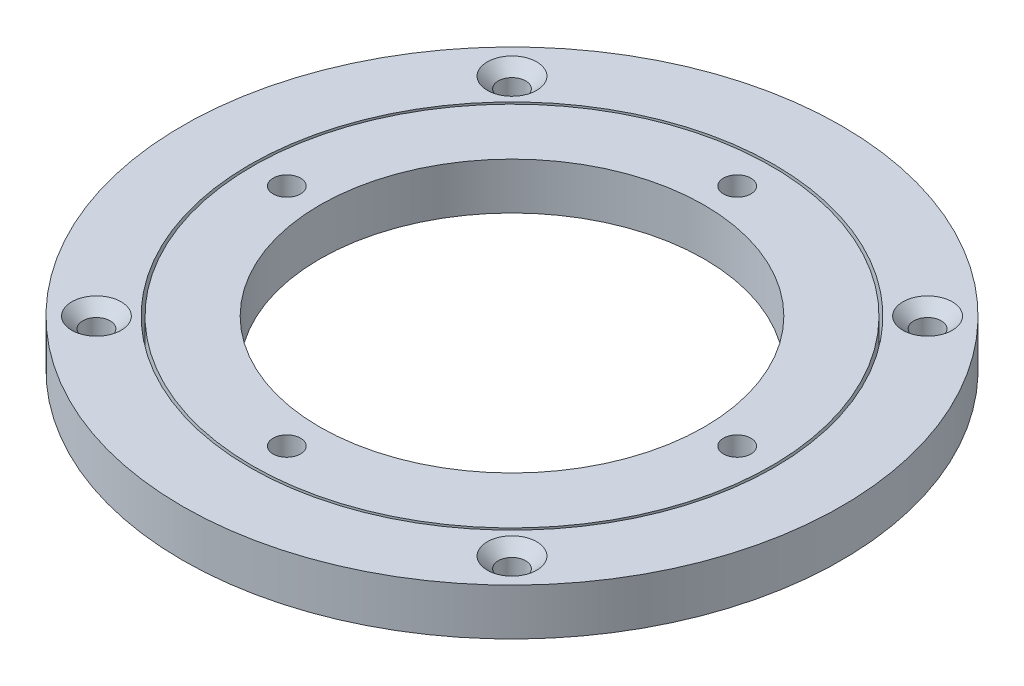
ISO-10303-21;
HEADER;
FILE_DESCRIPTION(('STEP AP214'),'2;1');
FILE_NAME('part.step','',(''),(''),'','','');
FILE_SCHEMA(('AUTOMOTIVE_DESIGN { 1 0 10303 214 1 1 1 1 }'));
ENDSEC;
DATA;
#1=APPLICATION_CONTEXT('core data for automotive mechanical design processes');
#2=APPLICATION_PROTOCOL_DEFINITION('international standard','automotive_design',2000,#1);
#3=PRODUCT_CONTEXT('',#1,'mechanical');
#4=PRODUCT('Part','Part','',(#3));
#5=PRODUCT_RELATED_PRODUCT_CATEGORY('part','',(#4));
#6=PRODUCT_DEFINITION_FORMATION('','',#4);
#7=PRODUCT_DEFINITION_CONTEXT('part definition',#1,'design');
#8=PRODUCT_DEFINITION('design','',#6,#7);
#9=PRODUCT_DEFINITION_SHAPE('','',#8);
#10=(LENGTH_UNIT() NAMED_UNIT(*) SI_UNIT(.MILLI.,.METRE.));
#11=(NAMED_UNIT(*) PLANE_ANGLE_UNIT() SI_UNIT($,.RADIAN.));
#12=(NAMED_UNIT(*) SI_UNIT($,.STERADIAN.) SOLID_ANGLE_UNIT());
#13=UNCERTAINTY_MEASURE_WITH_UNIT(LENGTH_MEASURE(1.E-05),#10,'distance_accuracy_value','');
#14=(GEOMETRIC_REPRESENTATION_CONTEXT(3) GLOBAL_UNCERTAINTY_ASSIGNED_CONTEXT((#13)) GLOBAL_UNIT_ASSIGNED_CONTEXT((#10,
#11,#12)) REPRESENTATION_CONTEXT('',''));
#15=CARTESIAN_POINT('',(0.,0.,0.));
#16=DIRECTION('',(0.,0.,1.));
#17=DIRECTION('',(1.,0.,0.));
#18=AXIS2_PLACEMENT_3D('',#15,#16,#17);
#19=CARTESIAN_POINT('',(0.,8.5,41.));
#20=DIRECTION('',(0.,-1.,0.));
#21=DIRECTION('',(0.,0.,-1.));
#22=AXIS2_PLACEMENT_3D('',#19,#20,#21);
#23=CYLINDRICAL_SURFACE('',#22,2.5);
#24=CARTESIAN_POINT('',(0.,8.5,41.));
#25=DIRECTION('',(0.,1.,0.));
#26=DIRECTION('',(0.,0.,1.));
#27=AXIS2_PLACEMENT_3D('',#24,#25,#26);
#28=CIRCLE('',#27,2.5);
#29=CARTESIAN_POINT('',(0.,8.5,43.5));
#30=VERTEX_POINT('',#29);
#31=EDGE_CURVE('E69',#30,#30,#28,.T.);
#32=ORIENTED_EDGE('',*,*,#31,.T.);
#33=EDGE_LOOP('',(#32));
#34=FACE_BOUND('',#33,.T.);
#35=CARTESIAN_POINT('',(0.,2.,41.));
#36=DIRECTION('',(0.,-1.,0.));
#37=DIRECTION('',(0.,0.,-1.));
#38=AXIS2_PLACEMENT_3D('',#35,#36,#37);
#39=CIRCLE('',#38,2.5);
#40=CARTESIAN_POINT('',(0.,2.,38.5));
#41=VERTEX_POINT('',#40);
#42=EDGE_CURVE('E126',#41,#41,#39,.T.);
#43=ORIENTED_EDGE('',*,*,#42,.T.);
#44=EDGE_LOOP('',(#43));
#45=FACE_BOUND('',#44,.T.);
#46=ADVANCED_FACE('F48',(#34,#45),#23,.F.);
#47=CARTESIAN_POINT('',(41.,8.5,0.));
#48=DIRECTION('',(0.,-1.,0.));
#49=DIRECTION('',(0.,0.,-1.));
#50=AXIS2_PLACEMENT_3D('',#47,#48,#49);
#51=CYLINDRICAL_SURFACE('',#50,2.49999999999999);
#52=CARTESIAN_POINT('',(41.,8.5,0.));
#53=DIRECTION('',(0.,1.,0.));
#54=DIRECTION('',(0.,0.,1.));
#55=AXIS2_PLACEMENT_3D('',#52,#53,#54);
#56=CIRCLE('',#55,2.49999999999999);
#57=CARTESIAN_POINT('',(41.,8.5,2.49999999999999));
#58=VERTEX_POINT('',#57);
#59=EDGE_CURVE('E60',#58,#58,#56,.T.);
#60=ORIENTED_EDGE('',*,*,#59,.T.);
#61=EDGE_LOOP('',(#60));
#62=FACE_BOUND('',#61,.T.);
#63=CARTESIAN_POINT('',(41.,2.,0.));
#64=DIRECTION('',(0.,-1.,0.));
#65=DIRECTION('',(0.,0.,-1.));
#66=AXIS2_PLACEMENT_3D('',#63,#64,#65);
#67=CIRCLE('',#66,2.5);
#68=CARTESIAN_POINT('',(41.,2.,-2.5));
#69=VERTEX_POINT('',#68);
#70=EDGE_CURVE('E76',#69,#69,#67,.T.);
#71=ORIENTED_EDGE('',*,*,#70,.T.);
#72=EDGE_LOOP('',(#71));
#73=FACE_BOUND('',#72,.T.);
#74=ADVANCED_FACE('F90',(#62,#73),#51,.F.);
#75=CARTESIAN_POINT('',(0.,8.5,-41.));
#76=DIRECTION('',(0.,-1.,0.));
#77=DIRECTION('',(0.,0.,-1.));
#78=AXIS2_PLACEMENT_3D('',#75,#76,#77);
#79=CYLINDRICAL_SURFACE('',#78,2.5);
#80=CARTESIAN_POINT('',(0.,8.5,-41.));
#81=DIRECTION('',(0.,1.,0.));
#82=DIRECTION('',(0.,0.,1.));
#83=AXIS2_PLACEMENT_3D('',#80,#81,#82);
#84=CIRCLE('',#83,2.5);
#85=CARTESIAN_POINT('',(0.,8.5,-38.5));
#86=VERTEX_POINT('',#85);
#87=EDGE_CURVE('E85',#86,#86,#84,.T.);
#88=ORIENTED_EDGE('',*,*,#87,.T.);
#89=EDGE_LOOP('',(#88));
#90=FACE_BOUND('',#89,.T.);
#91=CARTESIAN_POINT('',(0.,2.,-41.));
#92=DIRECTION('',(0.,-1.,0.));
#93=DIRECTION('',(0.,0.,-1.));
#94=AXIS2_PLACEMENT_3D('',#91,#92,#93);
#95=CIRCLE('',#94,2.5);
#96=CARTESIAN_POINT('',(0.,2.,-43.5));
#97=VERTEX_POINT('',#96);
#98=EDGE_CURVE('E65',#97,#97,#95,.T.);
#99=ORIENTED_EDGE('',*,*,#98,.T.);
#100=EDGE_LOOP('',(#99));
#101=FACE_BOUND('',#100,.T.);
#102=ADVANCED_FACE('F106',(#90,#101),#79,.F.);
#103=CARTESIAN_POINT('',(0.,8.5,0.));
#104=DIRECTION('',(0.,-1.,0.));
#105=DIRECTION('',(0.,0.,-1.));
#106=AXIS2_PLACEMENT_3D('',#103,#104,#105);
#107=CYLINDRICAL_SURFACE('',#106,35.);
#108=CARTESIAN_POINT('',(0.,8.5,0.));
#109=DIRECTION('',(0.,1.,0.));
#110=DIRECTION('',(0.,0.,1.));
#111=AXIS2_PLACEMENT_3D('',#108,#109,#110);
#112=CIRCLE('',#111,35.);
#113=CARTESIAN_POINT('',(0.,8.5,35.));
#114=VERTEX_POINT('',#113);
#115=EDGE_CURVE('E55',#114,#114,#112,.T.);
#116=ORIENTED_EDGE('',*,*,#115,.T.);
#117=EDGE_LOOP('',(#116));
#118=FACE_BOUND('',#117,.T.);
#119=CARTESIAN_POINT('',(0.,0.,0.));
#120=DIRECTION('',(0.,1.,0.));
#121=DIRECTION('',(0.,0.,1.));
#122=AXIS2_PLACEMENT_3D('',#119,#120,#121);
#123=CIRCLE('',#122,35.);
#124=CARTESIAN_POINT('',(0.,0.,35.));
#125=VERTEX_POINT('',#124);
#126=EDGE_CURVE('E63',#125,#125,#123,.T.);
#127=ORIENTED_EDGE('',*,*,#126,.F.);
#128=EDGE_LOOP('',(#127));
#129=FACE_BOUND('',#128,.T.);
#130=ADVANCED_FACE('F102',(#118,#129),#107,.F.);
#131=CARTESIAN_POINT('',(-41.,8.5,0.));
#132=DIRECTION('',(0.,-1.,0.));
#133=DIRECTION('',(0.,0.,-1.));
#134=AXIS2_PLACEMENT_3D('',#131,#132,#133);
#135=CYLINDRICAL_SURFACE('',#134,2.49999999999999);
#136=CARTESIAN_POINT('',(-41.,2.,0.));
#137=DIRECTION('',(0.,-1.,0.));
#138=DIRECTION('',(0.,0.,-1.));
#139=AXIS2_PLACEMENT_3D('',#136,#137,#138);
#140=CIRCLE('',#139,2.5);
#141=CARTESIAN_POINT('',(-41.,2.,-2.5));
#142=VERTEX_POINT('',#141);
#143=EDGE_CURVE('E134',#142,#142,#140,.T.);
#144=ORIENTED_EDGE('',*,*,#143,.T.);
#145=EDGE_LOOP('',(#144));
#146=FACE_BOUND('',#145,.T.);
#147=CARTESIAN_POINT('',(-41.,8.5,0.));
#148=DIRECTION('',(0.,1.,0.));
#149=DIRECTION('',(0.,0.,1.));
#150=AXIS2_PLACEMENT_3D('',#147,#148,#149);
#151=CIRCLE('',#150,2.49999999999999);
#152=CARTESIAN_POINT('',(-41.,8.5,2.49999999999999));
#153=VERTEX_POINT('',#152);
#154=EDGE_CURVE('E82',#153,#153,#151,.T.);
#155=ORIENTED_EDGE('',*,*,#154,.T.);
#156=EDGE_LOOP('',(#155));
#157=FACE_BOUND('',#156,.T.);
#158=ADVANCED_FACE('F105',(#146,#157),#135,.F.);
#159=CARTESIAN_POINT('',(0.,8.5,0.));
#160=DIRECTION('',(0.,-1.,0.));
#161=DIRECTION('',(0.,0.,-1.));
#162=AXIS2_PLACEMENT_3D('',#159,#160,#161);
#163=CYLINDRICAL_SURFACE('',#162,47.25);
#164=CARTESIAN_POINT('',(0.,8.5,0.));
#165=DIRECTION('',(0.,1.,0.));
#166=DIRECTION('',(0.,0.,1.));
#167=AXIS2_PLACEMENT_3D('',#164,#165,#166);
#168=CIRCLE('',#167,47.25);
#169=CARTESIAN_POINT('',(0.,8.5,47.25));
#170=VERTEX_POINT('',#169);
#171=EDGE_CURVE('E12',#170,#170,#168,.T.);
#172=ORIENTED_EDGE('',*,*,#171,.F.);
#173=EDGE_LOOP('',(#172));
#174=FACE_BOUND('',#173,.T.);
#175=CARTESIAN_POINT('',(0.,0.,0.));
#176=DIRECTION('',(0.,1.,0.));
#177=DIRECTION('',(0.,0.,1.));
#178=AXIS2_PLACEMENT_3D('',#175,#176,#177);
#179=CIRCLE('',#178,47.25);
#180=CARTESIAN_POINT('',(0.,0.,47.25));
#181=VERTEX_POINT('',#180);
#182=EDGE_CURVE('E51',#181,#181,#179,.T.);
#183=ORIENTED_EDGE('',*,*,#182,.T.);
#184=EDGE_LOOP('',(#183));
#185=FACE_BOUND('',#184,.T.);
#186=ADVANCED_FACE('F97',(#174,#185),#163,.T.);
#187=CARTESIAN_POINT('',(0.,8.5,0.));
#188=DIRECTION('',(0.,1.,0.));
#189=DIRECTION('',(0.,0.,1.));
#190=AXIS2_PLACEMENT_3D('',#187,#188,#189);
#191=PLANE('',#190);
#192=ORIENTED_EDGE('',*,*,#31,.F.);
#193=EDGE_LOOP('',(#192));
#194=FACE_BOUND('',#193,.T.);
#195=ORIENTED_EDGE('',*,*,#154,.F.);
#196=EDGE_LOOP('',(#195));
#197=FACE_BOUND('',#196,.T.);
#198=ORIENTED_EDGE('',*,*,#87,.F.);
#199=EDGE_LOOP('',(#198));
#200=FACE_BOUND('',#199,.T.);
#201=ORIENTED_EDGE('',*,*,#59,.F.);
#202=EDGE_LOOP('',(#201));
#203=FACE_BOUND('',#202,.T.);
#204=ORIENTED_EDGE('',*,*,#115,.F.);
#205=EDGE_LOOP('',(#204));
#206=FACE_BOUND('',#205,.T.);
#207=ORIENTED_EDGE('',*,*,#171,.T.);
#208=EDGE_LOOP('',(#207));
#209=FACE_BOUND('',#208,.T.);
#210=ADVANCED_FACE('F93',(#194,#197,#200,#203,#206,#209),#191,.T.);
#211=CARTESIAN_POINT('',(0.,0.,0.));
#212=DIRECTION('',(0.,1.,0.));
#213=DIRECTION('',(0.,0.,1.));
#214=AXIS2_PLACEMENT_3D('',#211,#212,#213);
#215=PLANE('',#214);
#216=CARTESIAN_POINT('',(-41.,0.,0.));
#217=DIRECTION('',(0.,-1.,0.));
#218=DIRECTION('',(0.,0.,-1.));
#219=AXIS2_PLACEMENT_3D('',#216,#217,#218);
#220=CIRCLE('',#219,4.5);
#221=CARTESIAN_POINT('',(-41.,0.,-4.5));
#222=VERTEX_POINT('',#221);
#223=EDGE_CURVE('E176',#222,#222,#220,.T.);
#224=ORIENTED_EDGE('',*,*,#223,.F.);
#225=EDGE_LOOP('',(#224));
#226=FACE_BOUND('',#225,.T.);
#227=CARTESIAN_POINT('',(0.,0.,41.));
#228=DIRECTION('',(0.,-1.,0.));
#229=DIRECTION('',(0.,0.,-1.));
#230=AXIS2_PLACEMENT_3D('',#227,#228,#229);
#231=CIRCLE('',#230,4.5);
#232=CARTESIAN_POINT('',(0.,0.,36.5));
#233=VERTEX_POINT('',#232);
#234=EDGE_CURVE('E129',#233,#233,#231,.T.);
#235=ORIENTED_EDGE('',*,*,#234,.F.);
#236=EDGE_LOOP('',(#235));
#237=FACE_BOUND('',#236,.T.);
#238=CARTESIAN_POINT('',(41.,0.,0.));
#239=DIRECTION('',(0.,-1.,0.));
#240=DIRECTION('',(0.,0.,-1.));
#241=AXIS2_PLACEMENT_3D('',#238,#239,#240);
#242=CIRCLE('',#241,4.5);
#243=CARTESIAN_POINT('',(41.,0.,-4.5));
#244=VERTEX_POINT('',#243);
#245=EDGE_CURVE('E128',#244,#244,#242,.T.);
#246=ORIENTED_EDGE('',*,*,#245,.F.);
#247=EDGE_LOOP('',(#246));
#248=FACE_BOUND('',#247,.T.);
#249=CARTESIAN_POINT('',(0.,0.,-41.));
#250=DIRECTION('',(0.,-1.,0.));
#251=DIRECTION('',(0.,0.,-1.));
#252=AXIS2_PLACEMENT_3D('',#249,#250,#251);
#253=CIRCLE('',#252,4.5);
#254=CARTESIAN_POINT('',(0.,0.,-45.5));
#255=VERTEX_POINT('',#254);
#256=EDGE_CURVE('E71',#255,#255,#253,.T.);
#257=ORIENTED_EDGE('',*,*,#256,.F.);
#258=EDGE_LOOP('',(#257));
#259=FACE_BOUND('',#258,.T.);
#260=ORIENTED_EDGE('',*,*,#126,.T.);
#261=EDGE_LOOP('',(#260));
#262=FACE_BOUND('',#261,.T.);
#263=ORIENTED_EDGE('',*,*,#182,.F.);
#264=EDGE_LOOP('',(#263));
#265=FACE_BOUND('',#264,.T.);
#266=ADVANCED_FACE('F96',(#226,#237,#248,#259,#262,#265),#215,.F.);
#267=CARTESIAN_POINT('',(0.,0.,-41.));
#268=DIRECTION('',(0.,-1.,0.));
#269=DIRECTION('',(0.,0.,-1.));
#270=AXIS2_PLACEMENT_3D('',#267,#268,#269);
#271=CONICAL_SURFACE('',#270,4.5,0.785398163397448);
#272=ORIENTED_EDGE('',*,*,#98,.F.);
#273=EDGE_LOOP('',(#272));
#274=FACE_BOUND('',#273,.T.);
#275=ORIENTED_EDGE('',*,*,#256,.T.);
#276=EDGE_LOOP('',(#275));
#277=FACE_BOUND('',#276,.T.);
#278=ADVANCED_FACE('F144',(#274,#277),#271,.F.);
#279=CARTESIAN_POINT('',(41.,0.,0.));
#280=DIRECTION('',(0.,-1.,0.));
#281=DIRECTION('',(0.,0.,-1.));
#282=AXIS2_PLACEMENT_3D('',#279,#280,#281);
#283=CONICAL_SURFACE('',#282,4.5,0.785398163397447);
#284=ORIENTED_EDGE('',*,*,#70,.F.);
#285=EDGE_LOOP('',(#284));
#286=FACE_BOUND('',#285,.T.);
#287=ORIENTED_EDGE('',*,*,#245,.T.);
#288=EDGE_LOOP('',(#287));
#289=FACE_BOUND('',#288,.T.);
#290=ADVANCED_FACE('F140',(#286,#289),#283,.F.);
#291=CARTESIAN_POINT('',(0.,0.,41.));
#292=DIRECTION('',(0.,-1.,0.));
#293=DIRECTION('',(0.,0.,-1.));
#294=AXIS2_PLACEMENT_3D('',#291,#292,#293);
#295=CONICAL_SURFACE('',#294,4.5,0.785398163397448);
#296=ORIENTED_EDGE('',*,*,#42,.F.);
#297=EDGE_LOOP('',(#296));
#298=FACE_BOUND('',#297,.T.);
#299=ORIENTED_EDGE('',*,*,#234,.T.);
#300=EDGE_LOOP('',(#299));
#301=FACE_BOUND('',#300,.T.);
#302=ADVANCED_FACE('F143',(#298,#301),#295,.F.);
#303=CARTESIAN_POINT('',(-41.,0.,0.));
#304=DIRECTION('',(0.,-1.,0.));
#305=DIRECTION('',(0.,0.,-1.));
#306=AXIS2_PLACEMENT_3D('',#303,#304,#305);
#307=CONICAL_SURFACE('',#306,4.5,0.785398163397447);
#308=ORIENTED_EDGE('',*,*,#143,.F.);
#309=EDGE_LOOP('',(#308));
#310=FACE_BOUND('',#309,.T.);
#311=ORIENTED_EDGE('',*,*,#223,.T.);
#312=EDGE_LOOP('',(#311));
#313=FACE_BOUND('',#312,.T.);
#314=ADVANCED_FACE('F166',(#310,#313),#307,.F.);
#315=CLOSED_SHELL('',(#46,#74,#102,#130,#158,#186,#210,#266,#278,#290,#302,#314));
#316=MANIFOLD_SOLID_BREP('B2',#315);
#317=CARTESIAN_POINT('',(-37.8302127934803,8.5,-37.8302127934803));
#318=DIRECTION('',(0.,-1.,0.));
#319=DIRECTION('',(0.,0.,-1.));
#320=AXIS2_PLACEMENT_3D('',#317,#318,#319);
#321=CYLINDRICAL_SURFACE('',#320,2.5);
#322=CARTESIAN_POINT('',(-37.8302127934803,0.,-37.8302127934803));
#323=DIRECTION('',(0.,1.,0.));
#324=DIRECTION('',(0.,0.,1.));
#325=AXIS2_PLACEMENT_3D('',#322,#323,#324);
#326=CIRCLE('',#325,2.5);
#327=CARTESIAN_POINT('',(-37.8302127934803,0.,-35.3302127934803));
#328=VERTEX_POINT('',#327);
#329=EDGE_CURVE('E279',#328,#328,#326,.T.);
#330=ORIENTED_EDGE('',*,*,#329,.F.);
#331=EDGE_LOOP('',(#330));
#332=FACE_BOUND('',#331,.T.);
#333=CARTESIAN_POINT('',(-37.8302127934803,6.5,-37.8302127934803));
#334=DIRECTION('',(0.,1.,0.));
#335=DIRECTION('',(0.,0.,1.));
#336=AXIS2_PLACEMENT_3D('',#333,#334,#335);
#337=CIRCLE('',#336,2.5);
#338=CARTESIAN_POINT('',(-37.8302127934803,6.5,-35.3302127934803));
#339=VERTEX_POINT('',#338);
#340=EDGE_CURVE('E410',#339,#339,#337,.T.);
#341=ORIENTED_EDGE('',*,*,#340,.T.);
#342=EDGE_LOOP('',(#341));
#343=FACE_BOUND('',#342,.T.);
#344=ADVANCED_FACE('F253',(#332,#343),#321,.F.);
#345=CARTESIAN_POINT('',(37.8302127934803,8.5,-37.8302127934803));
#346=DIRECTION('',(0.,-1.,0.));
#347=DIRECTION('',(0.,0.,-1.));
#348=AXIS2_PLACEMENT_3D('',#345,#346,#347);
#349=CYLINDRICAL_SURFACE('',#348,2.5);
#350=CARTESIAN_POINT('',(37.8302127934803,0.,-37.8302127934803));
#351=DIRECTION('',(0.,1.,0.));
#352=DIRECTION('',(0.,0.,1.));
#353=AXIS2_PLACEMENT_3D('',#350,#351,#352);
#354=CIRCLE('',#353,2.5);
#355=CARTESIAN_POINT('',(37.8302127934803,0.,-35.3302127934803));
#356=VERTEX_POINT('',#355);
#357=EDGE_CURVE('E281',#356,#356,#354,.T.);
#358=ORIENTED_EDGE('',*,*,#357,.F.);
#359=EDGE_LOOP('',(#358));
#360=FACE_BOUND('',#359,.T.);
#361=CARTESIAN_POINT('',(37.8302127934803,6.5,-37.8302127934803));
#362=DIRECTION('',(0.,1.,0.));
#363=DIRECTION('',(0.,0.,1.));
#364=AXIS2_PLACEMENT_3D('',#361,#362,#363);
#365=CIRCLE('',#364,2.5);
#366=CARTESIAN_POINT('',(37.8302127934803,6.5,-35.3302127934803));
#367=VERTEX_POINT('',#366);
#368=EDGE_CURVE('E339',#367,#367,#365,.T.);
#369=ORIENTED_EDGE('',*,*,#368,.T.);
#370=EDGE_LOOP('',(#369));
#371=FACE_BOUND('',#370,.T.);
#372=ADVANCED_FACE('F308',(#360,#371),#349,.F.);
#373=CARTESIAN_POINT('',(37.8302127934803,8.5,37.8302127934803));
#374=DIRECTION('',(0.,-1.,0.));
#375=DIRECTION('',(0.,0.,-1.));
#376=AXIS2_PLACEMENT_3D('',#373,#374,#375);
#377=CYLINDRICAL_SURFACE('',#376,2.5);
#378=CARTESIAN_POINT('',(37.8302127934803,0.,37.8302127934803));
#379=DIRECTION('',(0.,1.,0.));
#380=DIRECTION('',(0.,0.,1.));
#381=AXIS2_PLACEMENT_3D('',#378,#379,#380);
#382=CIRCLE('',#381,2.5);
#383=CARTESIAN_POINT('',(37.8302127934803,0.,40.3302127934803));
#384=VERTEX_POINT('',#383);
#385=EDGE_CURVE('E272',#384,#384,#382,.T.);
#386=ORIENTED_EDGE('',*,*,#385,.F.);
#387=EDGE_LOOP('',(#386));
#388=FACE_BOUND('',#387,.T.);
#389=CARTESIAN_POINT('',(37.8302127934803,6.5,37.8302127934803));
#390=DIRECTION('',(0.,1.,0.));
#391=DIRECTION('',(0.,0.,1.));
#392=AXIS2_PLACEMENT_3D('',#389,#390,#391);
#393=CIRCLE('',#392,2.5);
#394=CARTESIAN_POINT('',(37.8302127934803,6.5,40.3302127934803));
#395=VERTEX_POINT('',#394);
#396=EDGE_CURVE('E331',#395,#395,#393,.T.);
#397=ORIENTED_EDGE('',*,*,#396,.T.);
#398=EDGE_LOOP('',(#397));
#399=FACE_BOUND('',#398,.T.);
#400=ADVANCED_FACE('F314',(#388,#399),#377,.F.);
#401=CARTESIAN_POINT('',(-37.8302127934803,8.5,37.8302127934803));
#402=DIRECTION('',(0.,-1.,0.));
#403=DIRECTION('',(0.,0.,-1.));
#404=AXIS2_PLACEMENT_3D('',#401,#402,#403);
#405=CYLINDRICAL_SURFACE('',#404,2.5);
#406=CARTESIAN_POINT('',(-37.8302127934803,0.,37.8302127934803));
#407=DIRECTION('',(0.,1.,0.));
#408=DIRECTION('',(0.,0.,1.));
#409=AXIS2_PLACEMENT_3D('',#406,#407,#408);
#410=CIRCLE('',#409,2.5);
#411=CARTESIAN_POINT('',(-37.8302127934803,0.,40.3302127934803));
#412=VERTEX_POINT('',#411);
#413=EDGE_CURVE('E276',#412,#412,#410,.T.);
#414=ORIENTED_EDGE('',*,*,#413,.F.);
#415=EDGE_LOOP('',(#414));
#416=FACE_BOUND('',#415,.T.);
#417=CARTESIAN_POINT('',(-37.8302127934803,6.5,37.8302127934803));
#418=DIRECTION('',(0.,1.,0.));
#419=DIRECTION('',(0.,0.,1.));
#420=AXIS2_PLACEMENT_3D('',#417,#418,#419);
#421=CIRCLE('',#420,2.5);
#422=CARTESIAN_POINT('',(-37.8302127934803,6.5,40.3302127934803));
#423=VERTEX_POINT('',#422);
#424=EDGE_CURVE('E273',#423,#423,#421,.T.);
#425=ORIENTED_EDGE('',*,*,#424,.T.);
#426=EDGE_LOOP('',(#425));
#427=FACE_BOUND('',#426,.T.);
#428=ADVANCED_FACE('F320',(#416,#427),#405,.F.);
#429=CARTESIAN_POINT('',(0.,8.5,0.));
#430=DIRECTION('',(0.,-1.,0.));
#431=DIRECTION('',(0.,0.,-1.));
#432=AXIS2_PLACEMENT_3D('',#429,#430,#431);
#433=CYLINDRICAL_SURFACE('',#432,47.75);
#434=CARTESIAN_POINT('',(0.,8.5,0.));
#435=DIRECTION('',(0.,1.,0.));
#436=DIRECTION('',(0.,0.,1.));
#437=AXIS2_PLACEMENT_3D('',#434,#435,#436);
#438=CIRCLE('',#437,47.75);
#439=CARTESIAN_POINT('',(0.,8.5,47.75));
#440=VERTEX_POINT('',#439);
#441=EDGE_CURVE('E261',#440,#440,#438,.T.);
#442=ORIENTED_EDGE('',*,*,#441,.T.);
#443=EDGE_LOOP('',(#442));
#444=FACE_BOUND('',#443,.T.);
#445=CARTESIAN_POINT('',(0.,0.,0.));
#446=DIRECTION('',(0.,1.,0.));
#447=DIRECTION('',(0.,0.,1.));
#448=AXIS2_PLACEMENT_3D('',#445,#446,#447);
#449=CIRCLE('',#448,47.75);
#450=CARTESIAN_POINT('',(0.,0.,47.75));
#451=VERTEX_POINT('',#450);
#452=EDGE_CURVE('E269',#451,#451,#449,.T.);
#453=ORIENTED_EDGE('',*,*,#452,.F.);
#454=EDGE_LOOP('',(#453));
#455=FACE_BOUND('',#454,.T.);
#456=ADVANCED_FACE('F255',(#444,#455),#433,.F.);
#457=CARTESIAN_POINT('',(0.,8.5,0.));
#458=DIRECTION('',(0.,-1.,0.));
#459=DIRECTION('',(0.,0.,-1.));
#460=AXIS2_PLACEMENT_3D('',#457,#458,#459);
#461=CYLINDRICAL_SURFACE('',#460,60.);
#462=CARTESIAN_POINT('',(0.,8.5,0.));
#463=DIRECTION('',(0.,1.,0.));
#464=DIRECTION('',(0.,0.,1.));
#465=AXIS2_PLACEMENT_3D('',#462,#463,#464);
#466=CIRCLE('',#465,60.);
#467=CARTESIAN_POINT('',(0.,8.5,60.));
#468=VERTEX_POINT('',#467);
#469=EDGE_CURVE('E47',#468,#468,#466,.T.);
#470=ORIENTED_EDGE('',*,*,#469,.F.);
#471=EDGE_LOOP('',(#470));
#472=FACE_BOUND('',#471,.T.);
#473=CARTESIAN_POINT('',(0.,0.,0.));
#474=DIRECTION('',(0.,1.,0.));
#475=DIRECTION('',(0.,0.,1.));
#476=AXIS2_PLACEMENT_3D('',#473,#474,#475);
#477=CIRCLE('',#476,60.);
#478=CARTESIAN_POINT('',(0.,0.,60.));
#479=VERTEX_POINT('',#478);
#480=EDGE_CURVE('E257',#479,#479,#477,.T.);
#481=ORIENTED_EDGE('',*,*,#480,.T.);
#482=EDGE_LOOP('',(#481));
#483=FACE_BOUND('',#482,.T.);
#484=ADVANCED_FACE('F288',(#472,#483),#461,.T.);
#485=CARTESIAN_POINT('',(0.,8.5,0.));
#486=DIRECTION('',(0.,1.,0.));
#487=DIRECTION('',(0.,0.,1.));
#488=AXIS2_PLACEMENT_3D('',#485,#486,#487);
#489=PLANE('',#488);
#490=CARTESIAN_POINT('',(-37.8302127934803,8.5,-37.8302127934803));
#491=DIRECTION('',(0.,1.,0.));
#492=DIRECTION('',(0.,0.,1.));
#493=AXIS2_PLACEMENT_3D('',#490,#491,#492);
#494=CIRCLE('',#493,4.5);
#495=CARTESIAN_POINT('',(-37.8302127934803,8.5,-33.3302127934803));
#496=VERTEX_POINT('',#495);
#497=EDGE_CURVE('E413',#496,#496,#494,.T.);
#498=ORIENTED_EDGE('',*,*,#497,.F.);
#499=EDGE_LOOP('',(#498));
#500=FACE_BOUND('',#499,.T.);
#501=CARTESIAN_POINT('',(37.8302127934803,8.5,-37.8302127934803));
#502=DIRECTION('',(0.,1.,0.));
#503=DIRECTION('',(0.,0.,1.));
#504=AXIS2_PLACEMENT_3D('',#501,#502,#503);
#505=CIRCLE('',#504,4.5);
#506=CARTESIAN_POINT('',(37.8302127934803,8.5,-33.3302127934803));
#507=VERTEX_POINT('',#506);
#508=EDGE_CURVE('E415',#507,#507,#505,.T.);
#509=ORIENTED_EDGE('',*,*,#508,.F.);
#510=EDGE_LOOP('',(#509));
#511=FACE_BOUND('',#510,.T.);
#512=CARTESIAN_POINT('',(37.8302127934803,8.5,37.8302127934803));
#513=DIRECTION('',(0.,1.,0.));
#514=DIRECTION('',(0.,0.,1.));
#515=AXIS2_PLACEMENT_3D('',#512,#513,#514);
#516=CIRCLE('',#515,4.5);
#517=CARTESIAN_POINT('',(37.8302127934803,8.5,42.3302127934803));
#518=VERTEX_POINT('',#517);
#519=EDGE_CURVE('E334',#518,#518,#516,.T.);
#520=ORIENTED_EDGE('',*,*,#519,.F.);
#521=EDGE_LOOP('',(#520));
#522=FACE_BOUND('',#521,.T.);
#523=CARTESIAN_POINT('',(-37.8302127934803,8.5,37.8302127934803));
#524=DIRECTION('',(0.,1.,0.));
#525=DIRECTION('',(0.,0.,1.));
#526=AXIS2_PLACEMENT_3D('',#523,#524,#525);
#527=CIRCLE('',#526,4.5);
#528=CARTESIAN_POINT('',(-37.8302127934803,8.5,42.3302127934803));
#529=VERTEX_POINT('',#528);
#530=EDGE_CURVE('E333',#529,#529,#527,.T.);
#531=ORIENTED_EDGE('',*,*,#530,.F.);
#532=EDGE_LOOP('',(#531));
#533=FACE_BOUND('',#532,.T.);
#534=ORIENTED_EDGE('',*,*,#441,.F.);
#535=EDGE_LOOP('',(#534));
#536=FACE_BOUND('',#535,.T.);
#537=ORIENTED_EDGE('',*,*,#469,.T.);
#538=EDGE_LOOP('',(#537));
#539=FACE_BOUND('',#538,.T.);
#540=ADVANCED_FACE('F293',(#500,#511,#522,#533,#536,#539),#489,.T.);
#541=CARTESIAN_POINT('',(0.,0.,0.));
#542=DIRECTION('',(0.,1.,0.));
#543=DIRECTION('',(0.,0.,1.));
#544=AXIS2_PLACEMENT_3D('',#541,#542,#543);
#545=PLANE('',#544);
#546=ORIENTED_EDGE('',*,*,#452,.T.);
#547=EDGE_LOOP('',(#546));
#548=FACE_BOUND('',#547,.T.);
#549=ORIENTED_EDGE('',*,*,#385,.T.);
#550=EDGE_LOOP('',(#549));
#551=FACE_BOUND('',#550,.T.);
#552=ORIENTED_EDGE('',*,*,#413,.T.);
#553=EDGE_LOOP('',(#552));
#554=FACE_BOUND('',#553,.T.);
#555=ORIENTED_EDGE('',*,*,#329,.T.);
#556=EDGE_LOOP('',(#555));
#557=FACE_BOUND('',#556,.T.);
#558=ORIENTED_EDGE('',*,*,#357,.T.);
#559=EDGE_LOOP('',(#558));
#560=FACE_BOUND('',#559,.T.);
#561=ORIENTED_EDGE('',*,*,#480,.F.);
#562=EDGE_LOOP('',(#561));
#563=FACE_BOUND('',#562,.T.);
#564=ADVANCED_FACE('F290',(#548,#551,#554,#557,#560,#563),#545,.F.);
#565=CARTESIAN_POINT('',(-37.8302127934803,8.5,37.8302127934803));
#566=DIRECTION('',(0.,1.,0.));
#567=DIRECTION('',(0.,0.,1.));
#568=AXIS2_PLACEMENT_3D('',#565,#566,#567);
#569=CONICAL_SURFACE('',#568,4.5,0.785398163397447);
#570=ORIENTED_EDGE('',*,*,#424,.F.);
#571=EDGE_LOOP('',(#570));
#572=FACE_BOUND('',#571,.T.);
#573=ORIENTED_EDGE('',*,*,#530,.T.);
#574=EDGE_LOOP('',(#573));
#575=FACE_BOUND('',#574,.T.);
#576=ADVANCED_FACE('F292',(#572,#575),#569,.F.);
#577=CARTESIAN_POINT('',(37.8302127934803,8.5,37.8302127934803));
#578=DIRECTION('',(0.,1.,0.));
#579=DIRECTION('',(0.,0.,1.));
#580=AXIS2_PLACEMENT_3D('',#577,#578,#579);
#581=CONICAL_SURFACE('',#580,4.5,0.785398163397447);
#582=ORIENTED_EDGE('',*,*,#396,.F.);
#583=EDGE_LOOP('',(#582));
#584=FACE_BOUND('',#583,.T.);
#585=ORIENTED_EDGE('',*,*,#519,.T.);
#586=EDGE_LOOP('',(#585));
#587=FACE_BOUND('',#586,.T.);
#588=ADVANCED_FACE('F300',(#584,#587),#581,.F.);
#589=CARTESIAN_POINT('',(37.8302127934803,8.5,-37.8302127934803));
#590=DIRECTION('',(0.,1.,0.));
#591=DIRECTION('',(0.,0.,1.));
#592=AXIS2_PLACEMENT_3D('',#589,#590,#591);
#593=CONICAL_SURFACE('',#592,4.5,0.785398163397447);
#594=ORIENTED_EDGE('',*,*,#368,.F.);
#595=EDGE_LOOP('',(#594));
#596=FACE_BOUND('',#595,.T.);
#597=ORIENTED_EDGE('',*,*,#508,.T.);
#598=EDGE_LOOP('',(#597));
#599=FACE_BOUND('',#598,.T.);
#600=ADVANCED_FACE('F384',(#596,#599),#593,.F.);
#601=CARTESIAN_POINT('',(-37.8302127934803,8.5,-37.8302127934803));
#602=DIRECTION('',(0.,1.,0.));
#603=DIRECTION('',(0.,0.,1.));
#604=AXIS2_PLACEMENT_3D('',#601,#602,#603);
#605=CONICAL_SURFACE('',#604,4.5,0.785398163397447);
#606=ORIENTED_EDGE('',*,*,#340,.F.);
#607=EDGE_LOOP('',(#606));
#608=FACE_BOUND('',#607,.T.);
#609=ORIENTED_EDGE('',*,*,#497,.T.);
#610=EDGE_LOOP('',(#609));
#611=FACE_BOUND('',#610,.T.);
#612=ADVANCED_FACE('F393',(#608,#611),#605,.F.);
#613=CLOSED_SHELL('',(#344,#372,#400,#428,#456,#484,#540,#564,#576,#588,#600,#612));
#614=MANIFOLD_SOLID_BREP('B7',#613);
#615=ADVANCED_BREP_SHAPE_REPRESENTATION('',(#18,#316,#614),#14);
#616=SHAPE_DEFINITION_REPRESENTATION(#9,#615);
ENDSEC;
END-ISO-10303-21;
